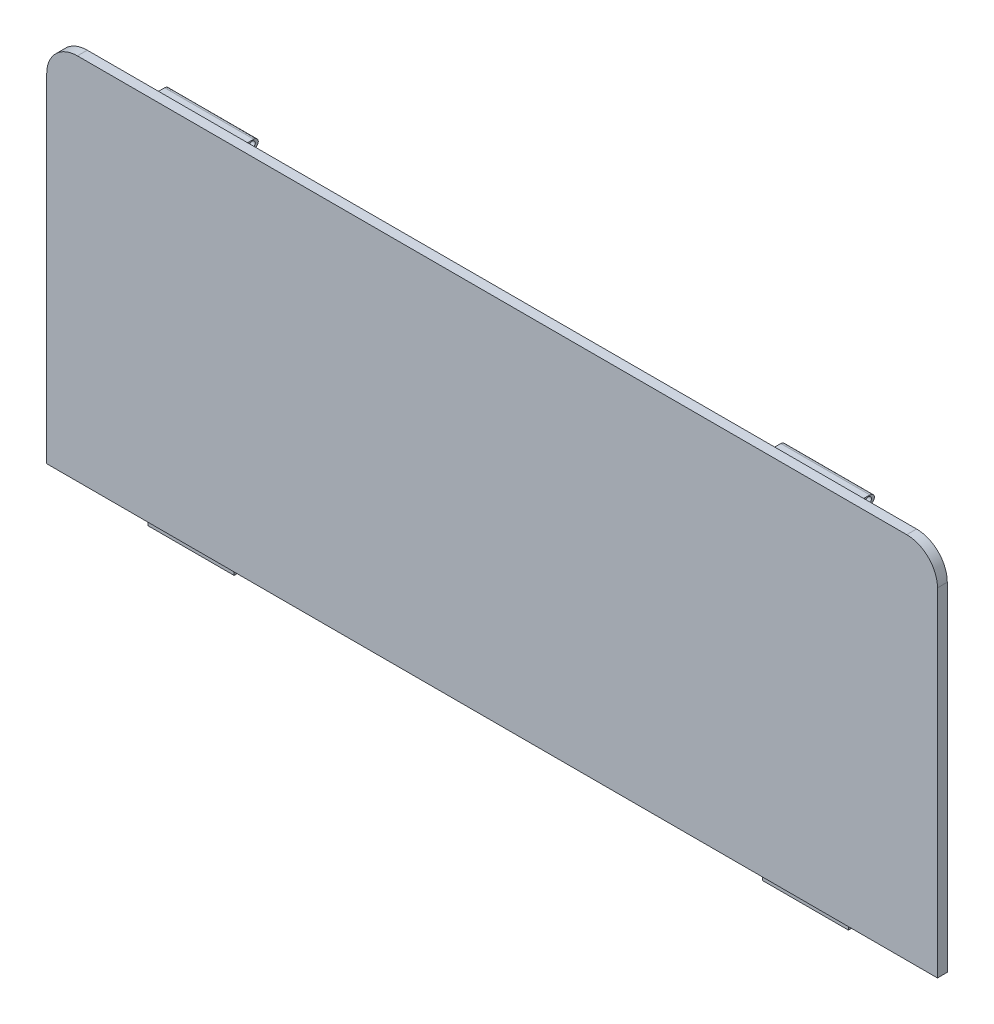
ISO-10303-21;
HEADER;
FILE_DESCRIPTION(('STEP AP214'),'2;1');
FILE_NAME('part.step','',(''),(''),'','','');
FILE_SCHEMA(('AUTOMOTIVE_DESIGN { 1 0 10303 214 1 1 1 1 }'));
ENDSEC;
DATA;
#1=APPLICATION_CONTEXT('core data for automotive mechanical design processes');
#2=APPLICATION_PROTOCOL_DEFINITION('international standard','automotive_design',2000,#1);
#3=PRODUCT_CONTEXT('',#1,'mechanical');
#4=PRODUCT('Part','Part','',(#3));
#5=PRODUCT_RELATED_PRODUCT_CATEGORY('part','',(#4));
#6=PRODUCT_DEFINITION_FORMATION('','',#4);
#7=PRODUCT_DEFINITION_CONTEXT('part definition',#1,'design');
#8=PRODUCT_DEFINITION('design','',#6,#7);
#9=PRODUCT_DEFINITION_SHAPE('','',#8);
#10=(LENGTH_UNIT() NAMED_UNIT(*) SI_UNIT(.MILLI.,.METRE.));
#11=(NAMED_UNIT(*) PLANE_ANGLE_UNIT() SI_UNIT($,.RADIAN.));
#12=(NAMED_UNIT(*) SI_UNIT($,.STERADIAN.) SOLID_ANGLE_UNIT());
#13=UNCERTAINTY_MEASURE_WITH_UNIT(LENGTH_MEASURE(1.E-05),#10,'distance_accuracy_value','');
#14=(GEOMETRIC_REPRESENTATION_CONTEXT(3) GLOBAL_UNCERTAINTY_ASSIGNED_CONTEXT((#13)) GLOBAL_UNIT_ASSIGNED_CONTEXT((#10,
#11,#12)) REPRESENTATION_CONTEXT('',''));
#15=CARTESIAN_POINT('',(0.,0.,0.));
#16=DIRECTION('',(0.,0.,1.));
#17=DIRECTION('',(1.,0.,0.));
#18=AXIS2_PLACEMENT_3D('',#15,#16,#17);
#19=CARTESIAN_POINT('',(123.79746835443,62.3768855076304,3.2));
#20=DIRECTION('',(-1.,0.,0.));
#21=DIRECTION('',(0.,-1.,0.));
#22=AXIS2_PLACEMENT_3D('',#19,#20,#21);
#23=PLANE('',#22);
#24=DIRECTION('',(0.,1.,0.));
#25=VECTOR('',#24,1.);
#26=CARTESIAN_POINT('',(123.79746835443,62.3768855076304,0.));
#27=LINE('',#26,#25);
#28=CARTESIAN_POINT('',(123.79746835443,-47.6231144923696,0.));
#29=VERTEX_POINT('',#28);
#30=CARTESIAN_POINT('',(123.79746835443,62.3768855076304,0.));
#31=VERTEX_POINT('',#30);
#32=EDGE_CURVE('E287',#29,#31,#27,.T.);
#33=ORIENTED_EDGE('',*,*,#32,.T.);
#34=DIRECTION('',(0.,0.,-1.));
#35=VECTOR('',#34,1.);
#36=CARTESIAN_POINT('',(123.79746835443,62.3768855076304,3.2));
#37=LINE('',#36,#35);
#38=CARTESIAN_POINT('',(123.79746835443,62.3768855076304,3.2));
#39=VERTEX_POINT('',#38);
#40=EDGE_CURVE('E347',#39,#31,#37,.T.);
#41=ORIENTED_EDGE('',*,*,#40,.F.);
#42=DIRECTION('',(0.,1.,0.));
#43=VECTOR('',#42,1.);
#44=CARTESIAN_POINT('',(123.79746835443,62.3768855076304,3.2));
#45=LINE('',#44,#43);
#46=CARTESIAN_POINT('',(123.79746835443,-47.6231144923696,3.2));
#47=VERTEX_POINT('',#46);
#48=EDGE_CURVE('E272',#47,#39,#45,.T.);
#49=ORIENTED_EDGE('',*,*,#48,.F.);
#50=DIRECTION('',(0.,0.,-1.));
#51=VECTOR('',#50,1.);
#52=CARTESIAN_POINT('',(123.79746835443,-47.6231144923696,3.2));
#53=LINE('',#52,#51);
#54=EDGE_CURVE('E350',#47,#29,#53,.T.);
#55=ORIENTED_EDGE('',*,*,#54,.T.);
#56=EDGE_LOOP('',(#33,#41,#49,#55));
#57=FACE_BOUND('',#56,.T.);
#58=ADVANCED_FACE('F33',(#57),#23,.F.);
#59=CARTESIAN_POINT('',(113.79746835443,62.3768855076304,3.2));
#60=DIRECTION('',(0.,0.,-1.));
#61=DIRECTION('',(-1.,0.,0.));
#62=AXIS2_PLACEMENT_3D('',#59,#60,#61);
#63=CYLINDRICAL_SURFACE('',#62,9.99999999999999);
#64=CARTESIAN_POINT('',(113.79746835443,62.3768855076304,0.));
#65=DIRECTION('',(0.,0.,1.));
#66=DIRECTION('',(-1.,0.,0.));
#67=AXIS2_PLACEMENT_3D('',#64,#65,#66);
#68=CIRCLE('',#67,9.99999999999999);
#69=CARTESIAN_POINT('',(113.79746835443,72.3768855076304,0.));
#70=VERTEX_POINT('',#69);
#71=EDGE_CURVE('E289',#31,#70,#68,.T.);
#72=ORIENTED_EDGE('',*,*,#71,.T.);
#73=DIRECTION('',(0.,0.,-1.));
#74=VECTOR('',#73,1.);
#75=CARTESIAN_POINT('',(113.79746835443,72.3768855076304,3.2));
#76=LINE('',#75,#74);
#77=CARTESIAN_POINT('',(113.79746835443,72.3768855076304,3.2));
#78=VERTEX_POINT('',#77);
#79=EDGE_CURVE('E344',#78,#70,#76,.T.);
#80=ORIENTED_EDGE('',*,*,#79,.F.);
#81=CARTESIAN_POINT('',(113.79746835443,62.3768855076304,3.2));
#82=DIRECTION('',(0.,0.,1.));
#83=DIRECTION('',(-1.,0.,0.));
#84=AXIS2_PLACEMENT_3D('',#81,#82,#83);
#85=CIRCLE('',#84,9.99999999999999);
#86=EDGE_CURVE('E275',#39,#78,#85,.T.);
#87=ORIENTED_EDGE('',*,*,#86,.F.);
#88=ORIENTED_EDGE('',*,*,#40,.T.);
#89=EDGE_LOOP('',(#72,#80,#87,#88));
#90=FACE_BOUND('',#89,.T.);
#91=ADVANCED_FACE('F418',(#90),#63,.T.);
#92=CARTESIAN_POINT('',(-156.20253164557,72.3768855076304,3.2));
#93=DIRECTION('',(0.,-1.,0.));
#94=DIRECTION('',(0.,0.,-1.));
#95=AXIS2_PLACEMENT_3D('',#92,#93,#94);
#96=PLANE('',#95);
#97=DIRECTION('',(-1.,0.,0.));
#98=VECTOR('',#97,1.);
#99=CARTESIAN_POINT('',(-156.20253164557,72.3768855076304,0.));
#100=LINE('',#99,#98);
#101=CARTESIAN_POINT('',(-156.20253164557,72.3768855076304,0.));
#102=VERTEX_POINT('',#101);
#103=EDGE_CURVE('E291',#70,#102,#100,.T.);
#104=ORIENTED_EDGE('',*,*,#103,.T.);
#105=DIRECTION('',(0.,0.,-1.));
#106=VECTOR('',#105,1.);
#107=CARTESIAN_POINT('',(-156.20253164557,72.3768855076304,3.2));
#108=LINE('',#107,#106);
#109=CARTESIAN_POINT('',(-156.20253164557,72.3768855076304,3.2));
#110=VERTEX_POINT('',#109);
#111=EDGE_CURVE('E341',#110,#102,#108,.T.);
#112=ORIENTED_EDGE('',*,*,#111,.F.);
#113=DIRECTION('',(-1.,0.,0.));
#114=VECTOR('',#113,1.);
#115=CARTESIAN_POINT('',(-156.20253164557,72.3768855076304,3.2));
#116=LINE('',#115,#114);
#117=EDGE_CURVE('E277',#78,#110,#116,.T.);
#118=ORIENTED_EDGE('',*,*,#117,.F.);
#119=ORIENTED_EDGE('',*,*,#79,.T.);
#120=EDGE_LOOP('',(#104,#112,#118,#119));
#121=FACE_BOUND('',#120,.T.);
#122=ADVANCED_FACE('F424',(#121),#96,.F.);
#123=CARTESIAN_POINT('',(-156.20253164557,62.3768855076304,3.2));
#124=DIRECTION('',(0.,0.,-1.));
#125=DIRECTION('',(-1.,0.,0.));
#126=AXIS2_PLACEMENT_3D('',#123,#124,#125);
#127=CYLINDRICAL_SURFACE('',#126,10.);
#128=CARTESIAN_POINT('',(-156.20253164557,62.3768855076304,0.));
#129=DIRECTION('',(0.,0.,1.));
#130=DIRECTION('',(1.,0.,0.));
#131=AXIS2_PLACEMENT_3D('',#128,#129,#130);
#132=CIRCLE('',#131,10.);
#133=CARTESIAN_POINT('',(-166.20253164557,62.3768855076304,0.));
#134=VERTEX_POINT('',#133);
#135=EDGE_CURVE('E293',#102,#134,#132,.T.);
#136=ORIENTED_EDGE('',*,*,#135,.T.);
#137=DIRECTION('',(0.,0.,-1.));
#138=VECTOR('',#137,1.);
#139=CARTESIAN_POINT('',(-166.20253164557,62.3768855076304,3.2));
#140=LINE('',#139,#138);
#141=CARTESIAN_POINT('',(-166.20253164557,62.3768855076304,3.2));
#142=VERTEX_POINT('',#141);
#143=EDGE_CURVE('E338',#142,#134,#140,.T.);
#144=ORIENTED_EDGE('',*,*,#143,.F.);
#145=CARTESIAN_POINT('',(-156.20253164557,62.3768855076304,3.2));
#146=DIRECTION('',(0.,0.,1.));
#147=DIRECTION('',(1.,0.,0.));
#148=AXIS2_PLACEMENT_3D('',#145,#146,#147);
#149=CIRCLE('',#148,10.);
#150=EDGE_CURVE('E279',#110,#142,#149,.T.);
#151=ORIENTED_EDGE('',*,*,#150,.F.);
#152=ORIENTED_EDGE('',*,*,#111,.T.);
#153=EDGE_LOOP('',(#136,#144,#151,#152));
#154=FACE_BOUND('',#153,.T.);
#155=ADVANCED_FACE('F610',(#154),#127,.T.);
#156=CARTESIAN_POINT('',(-166.20253164557,62.3768855076304,3.2));
#157=DIRECTION('',(1.,0.,0.));
#158=DIRECTION('',(0.,1.,0.));
#159=AXIS2_PLACEMENT_3D('',#156,#157,#158);
#160=PLANE('',#159);
#161=DIRECTION('',(0.,-1.,0.));
#162=VECTOR('',#161,1.);
#163=CARTESIAN_POINT('',(-166.20253164557,62.3768855076304,0.));
#164=LINE('',#163,#162);
#165=CARTESIAN_POINT('',(-166.20253164557,-47.6231144923696,0.));
#166=VERTEX_POINT('',#165);
#167=EDGE_CURVE('E295',#134,#166,#164,.T.);
#168=ORIENTED_EDGE('',*,*,#167,.T.);
#169=DIRECTION('',(0.,0.,-1.));
#170=VECTOR('',#169,1.);
#171=CARTESIAN_POINT('',(-166.20253164557,-47.6231144923696,3.2));
#172=LINE('',#171,#170);
#173=CARTESIAN_POINT('',(-166.20253164557,-47.6231144923696,3.2));
#174=VERTEX_POINT('',#173);
#175=EDGE_CURVE('E335',#174,#166,#172,.T.);
#176=ORIENTED_EDGE('',*,*,#175,.F.);
#177=DIRECTION('',(0.,-1.,0.));
#178=VECTOR('',#177,1.);
#179=CARTESIAN_POINT('',(-166.20253164557,62.3768855076304,3.2));
#180=LINE('',#179,#178);
#181=EDGE_CURVE('E281',#142,#174,#180,.T.);
#182=ORIENTED_EDGE('',*,*,#181,.F.);
#183=ORIENTED_EDGE('',*,*,#143,.T.);
#184=EDGE_LOOP('',(#168,#176,#182,#183));
#185=FACE_BOUND('',#184,.T.);
#186=ADVANCED_FACE('F602',(#185),#160,.F.);
#187=CARTESIAN_POINT('',(-135.20253164557,-47.6231144923696,3.2));
#188=DIRECTION('',(1.,0.,0.));
#189=DIRECTION('',(0.,1.,0.));
#190=AXIS2_PLACEMENT_3D('',#187,#188,#189);
#191=PLANE('',#190);
#192=DIRECTION('',(0.,0.,-1.));
#193=VECTOR('',#192,1.);
#194=CARTESIAN_POINT('',(-135.20253164557,-50.6231144923696,3.2));
#195=LINE('',#194,#193);
#196=CARTESIAN_POINT('',(-135.20253164557,-50.6231144923696,1.2));
#197=VERTEX_POINT('',#196);
#198=CARTESIAN_POINT('',(-135.20253164557,-50.6231144923696,0.));
#199=VERTEX_POINT('',#198);
#200=EDGE_CURVE('E331',#197,#199,#195,.T.);
#201=ORIENTED_EDGE('',*,*,#200,.F.);
#202=DIRECTION('',(0.,-1.,0.));
#203=VECTOR('',#202,1.);
#204=CARTESIAN_POINT('',(-135.20253164557,-50.6231144923696,1.2));
#205=LINE('',#204,#203);
#206=CARTESIAN_POINT('',(-135.20253164557,-47.6231144923696,1.2));
#207=VERTEX_POINT('',#206);
#208=EDGE_CURVE('E253',#207,#197,#205,.T.);
#209=ORIENTED_EDGE('',*,*,#208,.F.);
#210=DIRECTION('',(0.,0.,-1.));
#211=VECTOR('',#210,1.);
#212=CARTESIAN_POINT('',(-135.20253164557,-47.6231144923696,3.2));
#213=LINE('',#212,#211);
#214=CARTESIAN_POINT('',(-135.20253164557,-47.6231144923696,0.));
#215=VERTEX_POINT('',#214);
#216=EDGE_CURVE('E333',#207,#215,#213,.T.);
#217=ORIENTED_EDGE('',*,*,#216,.T.);
#218=DIRECTION('',(0.,-1.,0.));
#219=VECTOR('',#218,1.);
#220=CARTESIAN_POINT('',(-135.20253164557,-47.6231144923696,0.));
#221=LINE('',#220,#219);
#222=EDGE_CURVE('E300',#215,#199,#221,.T.);
#223=ORIENTED_EDGE('',*,*,#222,.T.);
#224=EDGE_LOOP('',(#201,#209,#217,#223));
#225=FACE_BOUND('',#224,.T.);
#226=ADVANCED_FACE('F594',(#225),#191,.F.);
#227=CARTESIAN_POINT('',(-135.20253164557,-50.6231144923696,3.2));
#228=DIRECTION('',(0.,1.,0.));
#229=DIRECTION('',(-1.,0.,0.));
#230=AXIS2_PLACEMENT_3D('',#227,#228,#229);
#231=PLANE('',#230);
#232=DIRECTION('',(0.,0.,-1.));
#233=VECTOR('',#232,1.);
#234=CARTESIAN_POINT('',(-107.20253164557,-50.6231144923696,3.2));
#235=LINE('',#234,#233);
#236=CARTESIAN_POINT('',(-107.20253164557,-50.6231144923696,1.2));
#237=VERTEX_POINT('',#236);
#238=CARTESIAN_POINT('',(-107.20253164557,-50.6231144923696,0.));
#239=VERTEX_POINT('',#238);
#240=EDGE_CURVE('E329',#237,#239,#235,.T.);
#241=ORIENTED_EDGE('',*,*,#240,.F.);
#242=DIRECTION('',(1.,0.,0.));
#243=VECTOR('',#242,1.);
#244=CARTESIAN_POINT('',(-135.20253164557,-50.6231144923696,1.2));
#245=LINE('',#244,#243);
#246=EDGE_CURVE('E255',#197,#237,#245,.T.);
#247=ORIENTED_EDGE('',*,*,#246,.F.);
#248=ORIENTED_EDGE('',*,*,#200,.T.);
#249=DIRECTION('',(1.,0.,0.));
#250=VECTOR('',#249,1.);
#251=CARTESIAN_POINT('',(-135.20253164557,-50.6231144923696,0.));
#252=LINE('',#251,#250);
#253=EDGE_CURVE('E303',#199,#239,#252,.T.);
#254=ORIENTED_EDGE('',*,*,#253,.T.);
#255=EDGE_LOOP('',(#241,#247,#248,#254));
#256=FACE_BOUND('',#255,.T.);
#257=ADVANCED_FACE('F586',(#256),#231,.F.);
#258=CARTESIAN_POINT('',(-107.20253164557,-47.6231144923696,3.2));
#259=DIRECTION('',(-1.,0.,0.));
#260=DIRECTION('',(0.,-1.,0.));
#261=AXIS2_PLACEMENT_3D('',#258,#259,#260);
#262=PLANE('',#261);
#263=DIRECTION('',(0.,0.,-1.));
#264=VECTOR('',#263,1.);
#265=CARTESIAN_POINT('',(-107.20253164557,-47.6231144923696,3.2));
#266=LINE('',#265,#264);
#267=CARTESIAN_POINT('',(-107.20253164557,-47.6231144923696,1.2));
#268=VERTEX_POINT('',#267);
#269=CARTESIAN_POINT('',(-107.20253164557,-47.6231144923696,0.));
#270=VERTEX_POINT('',#269);
#271=EDGE_CURVE('E327',#268,#270,#266,.T.);
#272=ORIENTED_EDGE('',*,*,#271,.F.);
#273=DIRECTION('',(0.,1.,0.));
#274=VECTOR('',#273,1.);
#275=CARTESIAN_POINT('',(-107.20253164557,-50.6231144923696,1.2));
#276=LINE('',#275,#274);
#277=EDGE_CURVE('E258',#237,#268,#276,.T.);
#278=ORIENTED_EDGE('',*,*,#277,.F.);
#279=ORIENTED_EDGE('',*,*,#240,.T.);
#280=DIRECTION('',(0.,1.,0.));
#281=VECTOR('',#280,1.);
#282=CARTESIAN_POINT('',(-107.20253164557,-47.6231144923696,0.));
#283=LINE('',#282,#281);
#284=EDGE_CURVE('E306',#239,#270,#283,.T.);
#285=ORIENTED_EDGE('',*,*,#284,.T.);
#286=EDGE_LOOP('',(#272,#278,#279,#285));
#287=FACE_BOUND('',#286,.T.);
#288=ADVANCED_FACE('F578',(#287),#262,.F.);
#289=CARTESIAN_POINT('',(-107.20253164557,-47.6231144923696,3.2));
#290=DIRECTION('',(0.,1.,0.));
#291=DIRECTION('',(-1.,0.,0.));
#292=AXIS2_PLACEMENT_3D('',#289,#290,#291);
#293=PLANE('',#292);
#294=DIRECTION('',(1.,0.,0.));
#295=VECTOR('',#294,1.);
#296=CARTESIAN_POINT('',(-107.20253164557,-47.6231144923696,0.));
#297=LINE('',#296,#295);
#298=CARTESIAN_POINT('',(64.7974683544304,-47.6231144923696,0.));
#299=VERTEX_POINT('',#298);
#300=EDGE_CURVE('E309',#270,#299,#297,.T.);
#301=ORIENTED_EDGE('',*,*,#300,.T.);
#302=DIRECTION('',(0.,0.,-1.));
#303=VECTOR('',#302,1.);
#304=CARTESIAN_POINT('',(64.7974683544304,-47.6231144923696,3.2));
#305=LINE('',#304,#303);
#306=CARTESIAN_POINT('',(64.7974683544304,-47.6231144923696,1.2));
#307=VERTEX_POINT('',#306);
#308=EDGE_CURVE('E325',#307,#299,#305,.T.);
#309=ORIENTED_EDGE('',*,*,#308,.F.);
#310=DIRECTION('',(-1.,0.,0.));
#311=VECTOR('',#310,1.);
#312=CARTESIAN_POINT('',(64.7974683544304,-47.6231144923696,1.2));
#313=LINE('',#312,#311);
#314=CARTESIAN_POINT('',(92.7974683544304,-47.6231144923696,1.2));
#315=VERTEX_POINT('',#314);
#316=EDGE_CURVE('E256',#315,#307,#313,.T.);
#317=ORIENTED_EDGE('',*,*,#316,.F.);
#318=DIRECTION('',(0.,0.,-1.));
#319=VECTOR('',#318,1.);
#320=CARTESIAN_POINT('',(92.7974683544304,-47.6231144923696,3.2));
#321=LINE('',#320,#319);
#322=CARTESIAN_POINT('',(92.7974683544304,-47.6231144923696,0.));
#323=VERTEX_POINT('',#322);
#324=EDGE_CURVE('E284',#315,#323,#321,.T.);
#325=ORIENTED_EDGE('',*,*,#324,.T.);
#326=DIRECTION('',(1.,0.,0.));
#327=VECTOR('',#326,1.);
#328=CARTESIAN_POINT('',(92.7974683544304,-47.6231144923696,0.));
#329=LINE('',#328,#327);
#330=EDGE_CURVE('E262',#323,#29,#329,.T.);
#331=ORIENTED_EDGE('',*,*,#330,.T.);
#332=ORIENTED_EDGE('',*,*,#54,.F.);
#333=DIRECTION('',(1.,0.,0.));
#334=VECTOR('',#333,1.);
#335=CARTESIAN_POINT('',(92.7974683544304,-47.6231144923696,3.2));
#336=LINE('',#335,#334);
#337=EDGE_CURVE('E269',#174,#47,#336,.T.);
#338=ORIENTED_EDGE('',*,*,#337,.F.);
#339=ORIENTED_EDGE('',*,*,#175,.T.);
#340=DIRECTION('',(1.,0.,0.));
#341=VECTOR('',#340,1.);
#342=CARTESIAN_POINT('',(-166.20253164557,-47.6231144923696,0.));
#343=LINE('',#342,#341);
#344=EDGE_CURVE('E297',#166,#215,#343,.T.);
#345=ORIENTED_EDGE('',*,*,#344,.T.);
#346=ORIENTED_EDGE('',*,*,#216,.F.);
#347=DIRECTION('',(-1.,0.,0.));
#348=VECTOR('',#347,1.);
#349=CARTESIAN_POINT('',(-135.20253164557,-47.6231144923696,1.2));
#350=LINE('',#349,#348);
#351=EDGE_CURVE('E260',#268,#207,#350,.T.);
#352=ORIENTED_EDGE('',*,*,#351,.F.);
#353=ORIENTED_EDGE('',*,*,#271,.T.);
#354=EDGE_LOOP('',(#301,#309,#317,#325,#331,#332,#338,#339,#345,#346,#352,#353));
#355=FACE_BOUND('',#354,.T.);
#356=ADVANCED_FACE('F570',(#355),#293,.F.);
#357=CARTESIAN_POINT('',(64.7974683544304,-47.6231144923696,3.2));
#358=DIRECTION('',(1.,0.,0.));
#359=DIRECTION('',(0.,0.,-1.));
#360=AXIS2_PLACEMENT_3D('',#357,#358,#359);
#361=PLANE('',#360);
#362=DIRECTION('',(0.,0.,-1.));
#363=VECTOR('',#362,1.);
#364=CARTESIAN_POINT('',(64.7974683544304,-50.6231144923696,3.2));
#365=LINE('',#364,#363);
#366=CARTESIAN_POINT('',(64.7974683544304,-50.6231144923696,1.2));
#367=VERTEX_POINT('',#366);
#368=CARTESIAN_POINT('',(64.7974683544304,-50.6231144923696,0.));
#369=VERTEX_POINT('',#368);
#370=EDGE_CURVE('E323',#367,#369,#365,.T.);
#371=ORIENTED_EDGE('',*,*,#370,.F.);
#372=DIRECTION('',(0.,-1.,0.));
#373=VECTOR('',#372,1.);
#374=CARTESIAN_POINT('',(64.7974683544304,-50.6231144923696,1.2));
#375=LINE('',#374,#373);
#376=EDGE_CURVE('E247',#307,#367,#375,.T.);
#377=ORIENTED_EDGE('',*,*,#376,.F.);
#378=ORIENTED_EDGE('',*,*,#308,.T.);
#379=DIRECTION('',(0.,-1.,0.));
#380=VECTOR('',#379,1.);
#381=CARTESIAN_POINT('',(64.7974683544304,-47.6231144923696,0.));
#382=LINE('',#381,#380);
#383=EDGE_CURVE('E312',#299,#369,#382,.T.);
#384=ORIENTED_EDGE('',*,*,#383,.T.);
#385=EDGE_LOOP('',(#371,#377,#378,#384));
#386=FACE_BOUND('',#385,.T.);
#387=ADVANCED_FACE('F562',(#386),#361,.F.);
#388=CARTESIAN_POINT('',(92.7974683544304,-50.6231144923696,3.2));
#389=DIRECTION('',(0.,1.,0.));
#390=DIRECTION('',(0.,0.,1.));
#391=AXIS2_PLACEMENT_3D('',#388,#389,#390);
#392=PLANE('',#391);
#393=DIRECTION('',(0.,0.,-1.));
#394=VECTOR('',#393,1.);
#395=CARTESIAN_POINT('',(92.7974683544304,-50.6231144923696,3.2));
#396=LINE('',#395,#394);
#397=CARTESIAN_POINT('',(92.7974683544304,-50.6231144923696,1.2));
#398=VERTEX_POINT('',#397);
#399=CARTESIAN_POINT('',(92.7974683544304,-50.6231144923696,0.));
#400=VERTEX_POINT('',#399);
#401=EDGE_CURVE('E321',#398,#400,#396,.T.);
#402=ORIENTED_EDGE('',*,*,#401,.F.);
#403=DIRECTION('',(1.,0.,0.));
#404=VECTOR('',#403,1.);
#405=CARTESIAN_POINT('',(64.7974683544304,-50.6231144923696,1.2));
#406=LINE('',#405,#404);
#407=EDGE_CURVE('E264',#367,#398,#406,.T.);
#408=ORIENTED_EDGE('',*,*,#407,.F.);
#409=ORIENTED_EDGE('',*,*,#370,.T.);
#410=DIRECTION('',(1.,0.,0.));
#411=VECTOR('',#410,1.);
#412=CARTESIAN_POINT('',(92.7974683544304,-50.6231144923696,0.));
#413=LINE('',#412,#411);
#414=EDGE_CURVE('E315',#369,#400,#413,.T.);
#415=ORIENTED_EDGE('',*,*,#414,.T.);
#416=EDGE_LOOP('',(#402,#408,#409,#415));
#417=FACE_BOUND('',#416,.T.);
#418=ADVANCED_FACE('F554',(#417),#392,.F.);
#419=CARTESIAN_POINT('',(92.7974683544304,-47.6231144923696,3.2));
#420=DIRECTION('',(-1.,0.,0.));
#421=DIRECTION('',(0.,0.,1.));
#422=AXIS2_PLACEMENT_3D('',#419,#420,#421);
#423=PLANE('',#422);
#424=ORIENTED_EDGE('',*,*,#324,.F.);
#425=DIRECTION('',(0.,1.,0.));
#426=VECTOR('',#425,1.);
#427=CARTESIAN_POINT('',(92.7974683544304,-50.6231144923696,1.2));
#428=LINE('',#427,#426);
#429=EDGE_CURVE('E266',#398,#315,#428,.T.);
#430=ORIENTED_EDGE('',*,*,#429,.F.);
#431=ORIENTED_EDGE('',*,*,#401,.T.);
#432=DIRECTION('',(0.,1.,0.));
#433=VECTOR('',#432,1.);
#434=CARTESIAN_POINT('',(92.7974683544304,-47.6231144923696,0.));
#435=LINE('',#434,#433);
#436=EDGE_CURVE('E273',#400,#323,#435,.T.);
#437=ORIENTED_EDGE('',*,*,#436,.T.);
#438=EDGE_LOOP('',(#424,#430,#431,#437));
#439=FACE_BOUND('',#438,.T.);
#440=ADVANCED_FACE('F546',(#439),#423,.F.);
#441=CARTESIAN_POINT('',(113.79746835443,62.3768855076304,3.2));
#442=DIRECTION('',(0.,0.,-1.));
#443=DIRECTION('',(-1.,0.,0.));
#444=AXIS2_PLACEMENT_3D('',#441,#442,#443);
#445=PLANE('',#444);
#446=ORIENTED_EDGE('',*,*,#181,.T.);
#447=ORIENTED_EDGE('',*,*,#337,.T.);
#448=ORIENTED_EDGE('',*,*,#48,.T.);
#449=ORIENTED_EDGE('',*,*,#86,.T.);
#450=ORIENTED_EDGE('',*,*,#117,.T.);
#451=ORIENTED_EDGE('',*,*,#150,.T.);
#452=EDGE_LOOP('',(#446,#447,#448,#449,#450,#451));
#453=FACE_BOUND('',#452,.T.);
#454=ADVANCED_FACE('F540',(#453),#445,.F.);
#455=CARTESIAN_POINT('',(113.79746835443,62.3768855076304,0.));
#456=DIRECTION('',(0.,0.,-1.));
#457=DIRECTION('',(-1.,0.,0.));
#458=AXIS2_PLACEMENT_3D('',#455,#456,#457);
#459=PLANE('',#458);
#460=DIRECTION('',(0.,1.,0.));
#461=VECTOR('',#460,1.);
#462=CARTESIAN_POINT('',(93.5974683544304,69.3768855076304,0.));
#463=LINE('',#462,#461);
#464=CARTESIAN_POINT('',(93.5974683544304,66.5768855076304,0.));
#465=VERTEX_POINT('',#464);
#466=CARTESIAN_POINT('',(93.5974683544304,69.3768855076304,0.));
#467=VERTEX_POINT('',#466);
#468=EDGE_CURVE('E199',#465,#467,#463,.T.);
#469=ORIENTED_EDGE('',*,*,#468,.T.);
#470=DIRECTION('',(-1.,0.,0.));
#471=VECTOR('',#470,1.);
#472=CARTESIAN_POINT('',(93.5974683544304,69.3768855076304,0.));
#473=LINE('',#472,#471);
#474=CARTESIAN_POINT('',(64.5974683544304,69.3768855076304,0.));
#475=VERTEX_POINT('',#474);
#476=EDGE_CURVE('E214',#467,#475,#473,.T.);
#477=ORIENTED_EDGE('',*,*,#476,.T.);
#478=DIRECTION('',(0.,-1.,0.));
#479=VECTOR('',#478,1.);
#480=CARTESIAN_POINT('',(64.5974683544304,69.3768855076304,0.));
#481=LINE('',#480,#479);
#482=CARTESIAN_POINT('',(64.5974683544304,66.5768855076304,0.));
#483=VERTEX_POINT('',#482);
#484=EDGE_CURVE('E221',#475,#483,#481,.T.);
#485=ORIENTED_EDGE('',*,*,#484,.T.);
#486=DIRECTION('',(1.,0.,0.));
#487=VECTOR('',#486,1.);
#488=CARTESIAN_POINT('',(93.5974683544304,66.5768855076304,0.));
#489=LINE('',#488,#487);
#490=EDGE_CURVE('E206',#483,#465,#489,.T.);
#491=ORIENTED_EDGE('',*,*,#490,.T.);
#492=EDGE_LOOP('',(#469,#477,#485,#491));
#493=FACE_BOUND('',#492,.T.);
#494=DIRECTION('',(0.,-1.,0.));
#495=VECTOR('',#494,1.);
#496=CARTESIAN_POINT('',(-136.00253164557,69.3768855076304,0.));
#497=LINE('',#496,#495);
#498=CARTESIAN_POINT('',(-136.00253164557,69.3768855076304,0.));
#499=VERTEX_POINT('',#498);
#500=CARTESIAN_POINT('',(-136.00253164557,66.5768855076304,0.));
#501=VERTEX_POINT('',#500);
#502=EDGE_CURVE('E229',#499,#501,#497,.T.);
#503=ORIENTED_EDGE('',*,*,#502,.T.);
#504=DIRECTION('',(1.,0.,0.));
#505=VECTOR('',#504,1.);
#506=CARTESIAN_POINT('',(-136.00253164557,66.5768855076304,0.));
#507=LINE('',#506,#505);
#508=CARTESIAN_POINT('',(-107.00253164557,66.5768855076304,0.));
#509=VERTEX_POINT('',#508);
#510=EDGE_CURVE('E235',#501,#509,#507,.T.);
#511=ORIENTED_EDGE('',*,*,#510,.T.);
#512=DIRECTION('',(0.,1.,0.));
#513=VECTOR('',#512,1.);
#514=CARTESIAN_POINT('',(-107.00253164557,69.3768855076304,0.));
#515=LINE('',#514,#513);
#516=CARTESIAN_POINT('',(-107.00253164557,69.3768855076304,0.));
#517=VERTEX_POINT('',#516);
#518=EDGE_CURVE('E238',#509,#517,#515,.T.);
#519=ORIENTED_EDGE('',*,*,#518,.T.);
#520=DIRECTION('',(-1.,0.,0.));
#521=VECTOR('',#520,1.);
#522=CARTESIAN_POINT('',(-136.00253164557,69.3768855076304,0.));
#523=LINE('',#522,#521);
#524=EDGE_CURVE('E241',#517,#499,#523,.T.);
#525=ORIENTED_EDGE('',*,*,#524,.T.);
#526=EDGE_LOOP('',(#503,#511,#519,#525));
#527=FACE_BOUND('',#526,.T.);
#528=ORIENTED_EDGE('',*,*,#330,.F.);
#529=ORIENTED_EDGE('',*,*,#436,.F.);
#530=ORIENTED_EDGE('',*,*,#414,.F.);
#531=ORIENTED_EDGE('',*,*,#383,.F.);
#532=ORIENTED_EDGE('',*,*,#300,.F.);
#533=ORIENTED_EDGE('',*,*,#284,.F.);
#534=ORIENTED_EDGE('',*,*,#253,.F.);
#535=ORIENTED_EDGE('',*,*,#222,.F.);
#536=ORIENTED_EDGE('',*,*,#344,.F.);
#537=ORIENTED_EDGE('',*,*,#167,.F.);
#538=ORIENTED_EDGE('',*,*,#135,.F.);
#539=ORIENTED_EDGE('',*,*,#103,.F.);
#540=ORIENTED_EDGE('',*,*,#71,.F.);
#541=ORIENTED_EDGE('',*,*,#32,.F.);
#542=EDGE_LOOP('',(#528,#529,#530,#531,#532,#533,#534,#535,#536,#537,#538,#539,#540,#541));
#543=FACE_BOUND('',#542,.T.);
#544=ADVANCED_FACE('F211',(#493,#527,#543),#459,.T.);
#545=CARTESIAN_POINT('',(0.,0.,1.2));
#546=DIRECTION('',(0.,0.,-1.));
#547=DIRECTION('',(-1.,0.,0.));
#548=AXIS2_PLACEMENT_3D('',#545,#546,#547);
#549=PLANE('',#548);
#550=ORIENTED_EDGE('',*,*,#376,.T.);
#551=ORIENTED_EDGE('',*,*,#407,.T.);
#552=ORIENTED_EDGE('',*,*,#429,.T.);
#553=ORIENTED_EDGE('',*,*,#316,.T.);
#554=EDGE_LOOP('',(#550,#551,#552,#553));
#555=FACE_BOUND('',#554,.T.);
#556=ADVANCED_FACE('F526',(#555),#549,.F.);
#557=CARTESIAN_POINT('',(0.,0.,1.2));
#558=DIRECTION('',(0.,0.,-1.));
#559=DIRECTION('',(-1.,0.,0.));
#560=AXIS2_PLACEMENT_3D('',#557,#558,#559);
#561=PLANE('',#560);
#562=ORIENTED_EDGE('',*,*,#208,.T.);
#563=ORIENTED_EDGE('',*,*,#246,.T.);
#564=ORIENTED_EDGE('',*,*,#277,.T.);
#565=ORIENTED_EDGE('',*,*,#351,.T.);
#566=EDGE_LOOP('',(#562,#563,#564,#565));
#567=FACE_BOUND('',#566,.T.);
#568=ADVANCED_FACE('F516',(#567),#561,.F.);
#569=CARTESIAN_POINT('',(-136.00253164557,69.3768855076304,-6.5));
#570=DIRECTION('',(-1.,0.,0.));
#571=DIRECTION('',(0.,0.,1.));
#572=AXIS2_PLACEMENT_3D('',#569,#570,#571);
#573=PLANE('',#572);
#574=CARTESIAN_POINT('',(-136.00253164557,68.0768855076304,-4.5));
#575=DIRECTION('',(-1.,0.,0.));
#576=DIRECTION('',(0.,0.,1.));
#577=AXIS2_PLACEMENT_3D('',#574,#575,#576);
#578=CIRCLE('',#577,1.);
#579=CARTESIAN_POINT('',(-136.00253164557,68.0768855076304,-3.5));
#580=VERTEX_POINT('',#579);
#581=EDGE_CURVE('E217',#580,#580,#578,.T.);
#582=ORIENTED_EDGE('',*,*,#581,.F.);
#583=EDGE_LOOP('',(#582));
#584=FACE_BOUND('',#583,.T.);
#585=CARTESIAN_POINT('',(-136.00253164557,67.8768855076304,-5.));
#586=DIRECTION('',(-1.,0.,0.));
#587=DIRECTION('',(0.,0.,1.));
#588=AXIS2_PLACEMENT_3D('',#585,#586,#587);
#589=CIRCLE('',#588,1.5);
#590=CARTESIAN_POINT('',(-136.00253164557,69.3768855076304,-5.));
#591=VERTEX_POINT('',#590);
#592=CARTESIAN_POINT('',(-136.00253164557,67.9768855076304,-6.49666295470958));
#593=VERTEX_POINT('',#592);
#594=EDGE_CURVE('E50',#591,#593,#589,.T.);
#595=ORIENTED_EDGE('',*,*,#594,.T.);
#596=CARTESIAN_POINT('',(-136.00253164557,68.0768855076304,-5.));
#597=DIRECTION('',(-1.,0.,0.));
#598=DIRECTION('',(0.,0.,1.));
#599=AXIS2_PLACEMENT_3D('',#596,#597,#598);
#600=CIRCLE('',#599,1.5);
#601=CARTESIAN_POINT('',(-136.00253164557,66.5768855076304,-5.));
#602=VERTEX_POINT('',#601);
#603=EDGE_CURVE('E376',#593,#602,#600,.T.);
#604=ORIENTED_EDGE('',*,*,#603,.T.);
#605=DIRECTION('',(0.,0.,1.));
#606=VECTOR('',#605,1.);
#607=CARTESIAN_POINT('',(-136.00253164557,66.5768855076304,-6.5));
#608=LINE('',#607,#606);
#609=EDGE_CURVE('E244',#602,#501,#608,.T.);
#610=ORIENTED_EDGE('',*,*,#609,.T.);
#611=ORIENTED_EDGE('',*,*,#502,.F.);
#612=DIRECTION('',(0.,0.,1.));
#613=VECTOR('',#612,1.);
#614=CARTESIAN_POINT('',(-136.00253164557,69.3768855076304,-6.5));
#615=LINE('',#614,#613);
#616=EDGE_CURVE('E245',#591,#499,#615,.T.);
#617=ORIENTED_EDGE('',*,*,#616,.F.);
#618=EDGE_LOOP('',(#595,#604,#610,#611,#617));
#619=FACE_BOUND('',#618,.T.);
#620=ADVANCED_FACE('F401',(#584,#619),#573,.T.);
#621=CARTESIAN_POINT('',(-136.00253164557,69.3768855076304,-6.5));
#622=DIRECTION('',(0.,1.,0.));
#623=DIRECTION('',(0.,0.,1.));
#624=AXIS2_PLACEMENT_3D('',#621,#622,#623);
#625=PLANE('',#624);
#626=DIRECTION('',(0.,0.,1.));
#627=VECTOR('',#626,1.);
#628=CARTESIAN_POINT('',(-107.00253164557,69.3768855076304,-6.5));
#629=LINE('',#628,#627);
#630=CARTESIAN_POINT('',(-107.00253164557,69.3768855076304,-5.));
#631=VERTEX_POINT('',#630);
#632=EDGE_CURVE('E248',#631,#517,#629,.T.);
#633=ORIENTED_EDGE('',*,*,#632,.F.);
#634=DIRECTION('',(-1.,0.,0.));
#635=VECTOR('',#634,1.);
#636=CARTESIAN_POINT('',(-136.00253164557,69.3768855076304,-5.));
#637=LINE('',#636,#635);
#638=EDGE_CURVE('E42',#631,#591,#637,.T.);
#639=ORIENTED_EDGE('',*,*,#638,.T.);
#640=ORIENTED_EDGE('',*,*,#616,.T.);
#641=ORIENTED_EDGE('',*,*,#524,.F.);
#642=EDGE_LOOP('',(#633,#639,#640,#641));
#643=FACE_BOUND('',#642,.T.);
#644=ADVANCED_FACE('F397',(#643),#625,.T.);
#645=CARTESIAN_POINT('',(-107.00253164557,69.3768855076304,-6.5));
#646=DIRECTION('',(1.,0.,0.));
#647=DIRECTION('',(0.,0.,-1.));
#648=AXIS2_PLACEMENT_3D('',#645,#646,#647);
#649=PLANE('',#648);
#650=CARTESIAN_POINT('',(-107.00253164557,68.0768855076304,-4.5));
#651=DIRECTION('',(1.,0.,0.));
#652=DIRECTION('',(0.,0.,-1.));
#653=AXIS2_PLACEMENT_3D('',#650,#651,#652);
#654=CIRCLE('',#653,1.);
#655=CARTESIAN_POINT('',(-107.00253164557,68.0768855076304,-5.5));
#656=VERTEX_POINT('',#655);
#657=EDGE_CURVE('E357',#656,#656,#654,.T.);
#658=ORIENTED_EDGE('',*,*,#657,.F.);
#659=EDGE_LOOP('',(#658));
#660=FACE_BOUND('',#659,.T.);
#661=DIRECTION('',(0.,0.,1.));
#662=VECTOR('',#661,1.);
#663=CARTESIAN_POINT('',(-107.00253164557,66.5768855076304,-6.5));
#664=LINE('',#663,#662);
#665=CARTESIAN_POINT('',(-107.00253164557,66.5768855076304,-5.));
#666=VERTEX_POINT('',#665);
#667=EDGE_CURVE('E250',#666,#509,#664,.T.);
#668=ORIENTED_EDGE('',*,*,#667,.F.);
#669=CARTESIAN_POINT('',(-107.00253164557,68.0768855076304,-5.));
#670=DIRECTION('',(1.,0.,0.));
#671=DIRECTION('',(0.,0.,-1.));
#672=AXIS2_PLACEMENT_3D('',#669,#670,#671);
#673=CIRCLE('',#672,1.5);
#674=CARTESIAN_POINT('',(-107.00253164557,67.9768855076304,-6.49666295470958));
#675=VERTEX_POINT('',#674);
#676=EDGE_CURVE('E373',#666,#675,#673,.T.);
#677=ORIENTED_EDGE('',*,*,#676,.T.);
#678=CARTESIAN_POINT('',(-107.00253164557,67.8768855076304,-5.));
#679=DIRECTION('',(1.,0.,0.));
#680=DIRECTION('',(0.,0.,-1.));
#681=AXIS2_PLACEMENT_3D('',#678,#679,#680);
#682=CIRCLE('',#681,1.5);
#683=EDGE_CURVE('E371',#675,#631,#682,.T.);
#684=ORIENTED_EDGE('',*,*,#683,.T.);
#685=ORIENTED_EDGE('',*,*,#632,.T.);
#686=ORIENTED_EDGE('',*,*,#518,.F.);
#687=EDGE_LOOP('',(#668,#677,#684,#685,#686));
#688=FACE_BOUND('',#687,.T.);
#689=ADVANCED_FACE('F394',(#660,#688),#649,.T.);
#690=CARTESIAN_POINT('',(-136.00253164557,66.5768855076304,-6.5));
#691=DIRECTION('',(0.,-1.,0.));
#692=DIRECTION('',(1.,0.,0.));
#693=AXIS2_PLACEMENT_3D('',#690,#691,#692);
#694=PLANE('',#693);
#695=ORIENTED_EDGE('',*,*,#609,.F.);
#696=DIRECTION('',(1.,0.,0.));
#697=VECTOR('',#696,1.);
#698=CARTESIAN_POINT('',(-107.00253164557,66.5768855076304,-5.));
#699=LINE('',#698,#697);
#700=EDGE_CURVE('E368',#602,#666,#699,.T.);
#701=ORIENTED_EDGE('',*,*,#700,.T.);
#702=ORIENTED_EDGE('',*,*,#667,.T.);
#703=ORIENTED_EDGE('',*,*,#510,.F.);
#704=EDGE_LOOP('',(#695,#701,#702,#703));
#705=FACE_BOUND('',#704,.T.);
#706=ADVANCED_FACE('F404',(#705),#694,.T.);
#707=CARTESIAN_POINT('',(93.5974683544304,69.3768855076304,-6.5));
#708=DIRECTION('',(1.,0.,0.));
#709=DIRECTION('',(0.,0.,-1.));
#710=AXIS2_PLACEMENT_3D('',#707,#708,#709);
#711=PLANE('',#710);
#712=CARTESIAN_POINT('',(93.5974683544304,68.0768855076304,-4.5));
#713=DIRECTION('',(1.,0.,0.));
#714=DIRECTION('',(0.,0.,-1.));
#715=AXIS2_PLACEMENT_3D('',#712,#713,#714);
#716=CIRCLE('',#715,1.);
#717=CARTESIAN_POINT('',(93.5974683544304,68.0768855076304,-5.5));
#718=VERTEX_POINT('',#717);
#719=EDGE_CURVE('E358',#718,#718,#716,.T.);
#720=ORIENTED_EDGE('',*,*,#719,.F.);
#721=EDGE_LOOP('',(#720));
#722=FACE_BOUND('',#721,.T.);
#723=DIRECTION('',(0.,0.,1.));
#724=VECTOR('',#723,1.);
#725=CARTESIAN_POINT('',(93.5974683544304,66.5768855076304,-6.5));
#726=LINE('',#725,#724);
#727=CARTESIAN_POINT('',(93.5974683544304,66.5768855076304,-5.));
#728=VERTEX_POINT('',#727);
#729=EDGE_CURVE('E227',#728,#465,#726,.T.);
#730=ORIENTED_EDGE('',*,*,#729,.F.);
#731=CARTESIAN_POINT('',(93.5974683544304,68.0768855076304,-5.));
#732=DIRECTION('',(1.,0.,0.));
#733=DIRECTION('',(0.,0.,-1.));
#734=AXIS2_PLACEMENT_3D('',#731,#732,#733);
#735=CIRCLE('',#734,1.5);
#736=CARTESIAN_POINT('',(93.5974683544304,67.9768855076304,-6.49666295470958));
#737=VERTEX_POINT('',#736);
#738=EDGE_CURVE('E362',#728,#737,#735,.T.);
#739=ORIENTED_EDGE('',*,*,#738,.T.);
#740=CARTESIAN_POINT('',(93.5974683544304,67.8768855076304,-5.));
#741=DIRECTION('',(1.,0.,0.));
#742=DIRECTION('',(0.,0.,-1.));
#743=AXIS2_PLACEMENT_3D('',#740,#741,#742);
#744=CIRCLE('',#743,1.5);
#745=CARTESIAN_POINT('',(93.5974683544304,69.3768855076304,-5.));
#746=VERTEX_POINT('',#745);
#747=EDGE_CURVE('E201',#737,#746,#744,.T.);
#748=ORIENTED_EDGE('',*,*,#747,.T.);
#749=DIRECTION('',(0.,0.,1.));
#750=VECTOR('',#749,1.);
#751=CARTESIAN_POINT('',(93.5974683544304,69.3768855076304,-6.5));
#752=LINE('',#751,#750);
#753=EDGE_CURVE('E195',#746,#467,#752,.T.);
#754=ORIENTED_EDGE('',*,*,#753,.T.);
#755=ORIENTED_EDGE('',*,*,#468,.F.);
#756=EDGE_LOOP('',(#730,#739,#748,#754,#755));
#757=FACE_BOUND('',#756,.T.);
#758=ADVANCED_FACE('F198',(#722,#757),#711,.T.);
#759=CARTESIAN_POINT('',(93.5974683544304,66.5768855076304,-6.5));
#760=DIRECTION('',(0.,-1.,0.));
#761=DIRECTION('',(0.,0.,-1.));
#762=AXIS2_PLACEMENT_3D('',#759,#760,#761);
#763=PLANE('',#762);
#764=DIRECTION('',(0.,0.,1.));
#765=VECTOR('',#764,1.);
#766=CARTESIAN_POINT('',(64.5974683544304,66.5768855076304,-6.5));
#767=LINE('',#766,#765);
#768=CARTESIAN_POINT('',(64.5974683544304,66.5768855076304,-5.));
#769=VERTEX_POINT('',#768);
#770=EDGE_CURVE('E230',#769,#483,#767,.T.);
#771=ORIENTED_EDGE('',*,*,#770,.F.);
#772=DIRECTION('',(1.,0.,0.));
#773=VECTOR('',#772,1.);
#774=CARTESIAN_POINT('',(93.5974683544304,66.5768855076304,-5.));
#775=LINE('',#774,#773);
#776=EDGE_CURVE('E353',#769,#728,#775,.T.);
#777=ORIENTED_EDGE('',*,*,#776,.T.);
#778=ORIENTED_EDGE('',*,*,#729,.T.);
#779=ORIENTED_EDGE('',*,*,#490,.F.);
#780=EDGE_LOOP('',(#771,#777,#778,#779));
#781=FACE_BOUND('',#780,.T.);
#782=ADVANCED_FACE('F411',(#781),#763,.T.);
#783=CARTESIAN_POINT('',(64.5974683544304,69.3768855076304,-6.5));
#784=DIRECTION('',(-1.,0.,0.));
#785=DIRECTION('',(0.,0.,1.));
#786=AXIS2_PLACEMENT_3D('',#783,#784,#785);
#787=PLANE('',#786);
#788=CARTESIAN_POINT('',(64.5974683544304,68.0768855076304,-4.5));
#789=DIRECTION('',(-1.,0.,0.));
#790=DIRECTION('',(0.,0.,1.));
#791=AXIS2_PLACEMENT_3D('',#788,#789,#790);
#792=CIRCLE('',#791,1.);
#793=CARTESIAN_POINT('',(64.5974683544304,68.0768855076304,-3.5));
#794=VERTEX_POINT('',#793);
#795=EDGE_CURVE('E354',#794,#794,#792,.T.);
#796=ORIENTED_EDGE('',*,*,#795,.F.);
#797=EDGE_LOOP('',(#796));
#798=FACE_BOUND('',#797,.T.);
#799=CARTESIAN_POINT('',(64.5974683544304,67.8768855076304,-5.));
#800=DIRECTION('',(-1.,0.,0.));
#801=DIRECTION('',(0.,0.,1.));
#802=AXIS2_PLACEMENT_3D('',#799,#800,#801);
#803=CIRCLE('',#802,1.5);
#804=CARTESIAN_POINT('',(64.5974683544304,69.3768855076304,-5.));
#805=VERTEX_POINT('',#804);
#806=CARTESIAN_POINT('',(64.5974683544304,67.9768855076304,-6.49666295470958));
#807=VERTEX_POINT('',#806);
#808=EDGE_CURVE('E364',#805,#807,#803,.T.);
#809=ORIENTED_EDGE('',*,*,#808,.T.);
#810=CARTESIAN_POINT('',(64.5974683544304,68.0768855076304,-5.));
#811=DIRECTION('',(-1.,0.,0.));
#812=DIRECTION('',(0.,0.,1.));
#813=AXIS2_PLACEMENT_3D('',#810,#811,#812);
#814=CIRCLE('',#813,1.5);
#815=EDGE_CURVE('E366',#807,#769,#814,.T.);
#816=ORIENTED_EDGE('',*,*,#815,.T.);
#817=ORIENTED_EDGE('',*,*,#770,.T.);
#818=ORIENTED_EDGE('',*,*,#484,.F.);
#819=DIRECTION('',(0.,0.,1.));
#820=VECTOR('',#819,1.);
#821=CARTESIAN_POINT('',(64.5974683544304,69.3768855076304,-6.5));
#822=LINE('',#821,#820);
#823=EDGE_CURVE('E205',#805,#475,#822,.T.);
#824=ORIENTED_EDGE('',*,*,#823,.F.);
#825=EDGE_LOOP('',(#809,#816,#817,#818,#824));
#826=FACE_BOUND('',#825,.T.);
#827=ADVANCED_FACE('F472',(#798,#826),#787,.T.);
#828=CARTESIAN_POINT('',(93.5974683544304,69.3768855076304,-6.5));
#829=DIRECTION('',(0.,1.,0.));
#830=DIRECTION('',(0.,0.,1.));
#831=AXIS2_PLACEMENT_3D('',#828,#829,#830);
#832=PLANE('',#831);
#833=ORIENTED_EDGE('',*,*,#753,.F.);
#834=DIRECTION('',(-1.,0.,0.));
#835=VECTOR('',#834,1.);
#836=CARTESIAN_POINT('',(93.5974683544304,69.3768855076304,-5.));
#837=LINE('',#836,#835);
#838=EDGE_CURVE('E11',#746,#805,#837,.T.);
#839=ORIENTED_EDGE('',*,*,#838,.T.);
#840=ORIENTED_EDGE('',*,*,#823,.T.);
#841=ORIENTED_EDGE('',*,*,#476,.F.);
#842=EDGE_LOOP('',(#833,#839,#840,#841));
#843=FACE_BOUND('',#842,.T.);
#844=ADVANCED_FACE('F219',(#843),#832,.T.);
#845=CARTESIAN_POINT('',(-166.20253164557,68.0768855076304,-4.5));
#846=DIRECTION('',(1.,0.,0.));
#847=DIRECTION('',(0.,0.,-1.));
#848=AXIS2_PLACEMENT_3D('',#845,#846,#847);
#849=CYLINDRICAL_SURFACE('',#848,1.);
#850=ORIENTED_EDGE('',*,*,#795,.T.);
#851=EDGE_LOOP('',(#850));
#852=FACE_BOUND('',#851,.T.);
#853=ORIENTED_EDGE('',*,*,#719,.T.);
#854=EDGE_LOOP('',(#853));
#855=FACE_BOUND('',#854,.T.);
#856=ADVANCED_FACE('F457',(#852,#855),#849,.F.);
#857=ORIENTED_EDGE('',*,*,#581,.T.);
#858=EDGE_LOOP('',(#857));
#859=FACE_BOUND('',#858,.T.);
#860=ORIENTED_EDGE('',*,*,#657,.T.);
#861=EDGE_LOOP('',(#860));
#862=FACE_BOUND('',#861,.T.);
#863=ADVANCED_FACE('F434',(#859,#862),#849,.F.);
#864=CARTESIAN_POINT('',(93.5974683544304,67.8768855076304,-5.));
#865=DIRECTION('',(-1.,0.,0.));
#866=DIRECTION('',(0.,0.,1.));
#867=AXIS2_PLACEMENT_3D('',#864,#865,#866);
#868=CYLINDRICAL_SURFACE('',#867,1.5);
#869=DIRECTION('',(-1.,0.,0.));
#870=VECTOR('',#869,1.);
#871=CARTESIAN_POINT('',(79.0974683544304,67.9768855076304,-6.49666295470958));
#872=LINE('',#871,#870);
#873=EDGE_CURVE('E378',#807,#737,#872,.F.);
#874=ORIENTED_EDGE('',*,*,#873,.F.);
#875=ORIENTED_EDGE('',*,*,#808,.F.);
#876=ORIENTED_EDGE('',*,*,#838,.F.);
#877=ORIENTED_EDGE('',*,*,#747,.F.);
#878=EDGE_LOOP('',(#874,#875,#876,#877));
#879=FACE_BOUND('',#878,.T.);
#880=ADVANCED_FACE('F432',(#879),#868,.T.);
#881=CARTESIAN_POINT('',(93.5974683544304,68.0768855076304,-5.));
#882=DIRECTION('',(1.,0.,0.));
#883=DIRECTION('',(0.,0.,-1.));
#884=AXIS2_PLACEMENT_3D('',#881,#882,#883);
#885=CYLINDRICAL_SURFACE('',#884,1.5);
#886=ORIENTED_EDGE('',*,*,#815,.F.);
#887=ORIENTED_EDGE('',*,*,#873,.T.);
#888=ORIENTED_EDGE('',*,*,#738,.F.);
#889=ORIENTED_EDGE('',*,*,#776,.F.);
#890=EDGE_LOOP('',(#886,#887,#888,#889));
#891=FACE_BOUND('',#890,.T.);
#892=ADVANCED_FACE('F429',(#891),#885,.T.);
#893=CARTESIAN_POINT('',(-136.00253164557,67.8768855076304,-5.));
#894=DIRECTION('',(1.,0.,0.));
#895=DIRECTION('',(0.,0.,-1.));
#896=AXIS2_PLACEMENT_3D('',#893,#894,#895);
#897=CYLINDRICAL_SURFACE('',#896,1.5);
#898=DIRECTION('',(1.,0.,0.));
#899=VECTOR('',#898,1.);
#900=CARTESIAN_POINT('',(-121.50253164557,67.9768855076304,-6.49666295470958));
#901=LINE('',#900,#899);
#902=EDGE_CURVE('E37',#593,#675,#901,.T.);
#903=ORIENTED_EDGE('',*,*,#902,.F.);
#904=ORIENTED_EDGE('',*,*,#594,.F.);
#905=ORIENTED_EDGE('',*,*,#638,.F.);
#906=ORIENTED_EDGE('',*,*,#683,.F.);
#907=EDGE_LOOP('',(#903,#904,#905,#906));
#908=FACE_BOUND('',#907,.T.);
#909=ADVANCED_FACE('F35',(#908),#897,.T.);
#910=CARTESIAN_POINT('',(-136.00253164557,68.0768855076304,-5.));
#911=DIRECTION('',(-1.,0.,0.));
#912=DIRECTION('',(0.,-1.,0.));
#913=AXIS2_PLACEMENT_3D('',#910,#911,#912);
#914=CYLINDRICAL_SURFACE('',#913,1.5);
#915=ORIENTED_EDGE('',*,*,#603,.F.);
#916=ORIENTED_EDGE('',*,*,#902,.T.);
#917=ORIENTED_EDGE('',*,*,#676,.F.);
#918=ORIENTED_EDGE('',*,*,#700,.F.);
#919=EDGE_LOOP('',(#915,#916,#917,#918));
#920=FACE_BOUND('',#919,.T.);
#921=ADVANCED_FACE('F388',(#920),#914,.T.);
#922=CLOSED_SHELL('',(#58,#91,#122,#155,#186,#226,#257,#288,#356,#387,#418,#440,#454,#544,#556,
#568,#620,#644,#689,#706,#758,#782,#827,#844,#856,#863,#880,#892,#909,#921));
#923=MANIFOLD_SOLID_BREP('B2',#922);
#924=ADVANCED_BREP_SHAPE_REPRESENTATION('',(#18,#923),#14);
#925=SHAPE_DEFINITION_REPRESENTATION(#9,#924);
ENDSEC;
END-ISO-10303-21;
